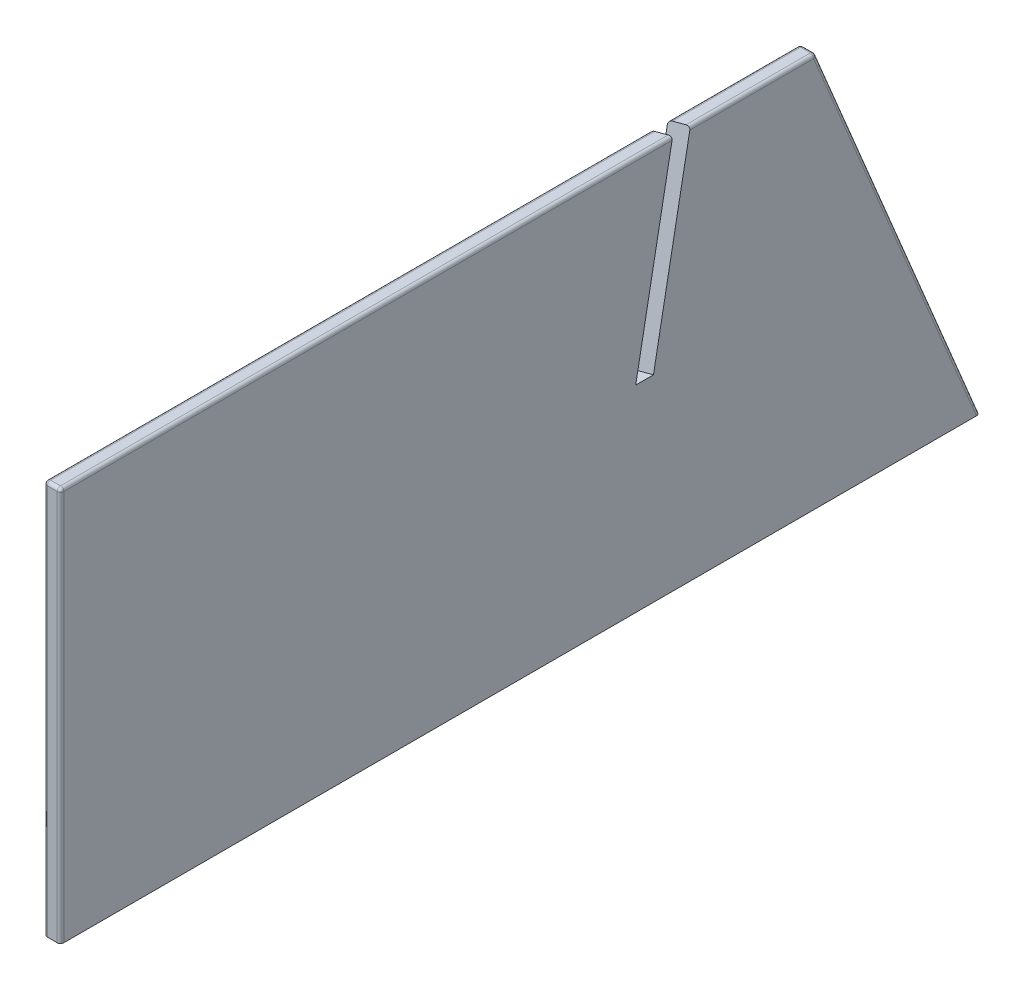
ISO-10303-21;
HEADER;
FILE_DESCRIPTION(('STEP AP214'),'2;1');
FILE_NAME('part.step','',(''),(''),'','','');
FILE_SCHEMA(('AUTOMOTIVE_DESIGN { 1 0 10303 214 1 1 1 1 }'));
ENDSEC;
DATA;
#1=APPLICATION_CONTEXT('core data for automotive mechanical design processes');
#2=APPLICATION_PROTOCOL_DEFINITION('international standard','automotive_design',2000,#1);
#3=PRODUCT_CONTEXT('',#1,'mechanical');
#4=PRODUCT('Part','Part','',(#3));
#5=PRODUCT_RELATED_PRODUCT_CATEGORY('part','',(#4));
#6=PRODUCT_DEFINITION_FORMATION('','',#4);
#7=PRODUCT_DEFINITION_CONTEXT('part definition',#1,'design');
#8=PRODUCT_DEFINITION('design','',#6,#7);
#9=PRODUCT_DEFINITION_SHAPE('','',#8);
#10=(LENGTH_UNIT() NAMED_UNIT(*) SI_UNIT(.MILLI.,.METRE.));
#11=(NAMED_UNIT(*) PLANE_ANGLE_UNIT() SI_UNIT($,.RADIAN.));
#12=(NAMED_UNIT(*) SI_UNIT($,.STERADIAN.) SOLID_ANGLE_UNIT());
#13=UNCERTAINTY_MEASURE_WITH_UNIT(LENGTH_MEASURE(1.E-05),#10,'distance_accuracy_value','');
#14=(GEOMETRIC_REPRESENTATION_CONTEXT(3) GLOBAL_UNCERTAINTY_ASSIGNED_CONTEXT((#13)) GLOBAL_UNIT_ASSIGNED_CONTEXT((#10,
#11,#12)) REPRESENTATION_CONTEXT('',''));
#15=CARTESIAN_POINT('',(0.,0.,0.));
#16=DIRECTION('',(0.,0.,1.));
#17=DIRECTION('',(1.,0.,0.));
#18=AXIS2_PLACEMENT_3D('',#15,#16,#17);
#19=CARTESIAN_POINT('',(12.7,304.8,0.));
#20=DIRECTION('',(0.,1.,0.));
#21=DIRECTION('',(0.,0.,1.));
#22=AXIS2_PLACEMENT_3D('',#19,#20,#21);
#23=PLANE('',#22);
#24=DIRECTION('',(-0.939692620785908,0.,0.342020143325669));
#25=VECTOR('',#24,1.);
#26=CARTESIAN_POINT('',(84.6850060438252,304.8,-513.422821355286));
#27=LINE('',#26,#25);
#28=CARTESIAN_POINT('',(10.16,304.8,-486.297937446825));
#29=VERTEX_POINT('',#28);
#30=CARTESIAN_POINT('',(2.54000000000001,304.8,-483.524484261717));
#31=VERTEX_POINT('',#30);
#32=EDGE_CURVE('E412',#29,#31,#27,.T.);
#33=ORIENTED_EDGE('',*,*,#32,.F.);
#34=DIRECTION('',(0.,0.,-1.));
#35=VECTOR('',#34,1.);
#36=CARTESIAN_POINT('',(10.16,304.8,0.));
#37=LINE('',#36,#35);
#38=CARTESIAN_POINT('',(10.16,304.8,-582.506666666667));
#39=VERTEX_POINT('',#38);
#40=EDGE_CURVE('E92',#29,#39,#37,.T.);
#41=ORIENTED_EDGE('',*,*,#40,.T.);
#42=DIRECTION('',(-1.,0.,0.));
#43=VECTOR('',#42,1.);
#44=CARTESIAN_POINT('',(0.,304.8,-582.506666666667));
#45=LINE('',#44,#43);
#46=CARTESIAN_POINT('',(2.54,304.8,-582.506666666667));
#47=VERTEX_POINT('',#46);
#48=EDGE_CURVE('E96',#39,#47,#45,.T.);
#49=ORIENTED_EDGE('',*,*,#48,.T.);
#50=DIRECTION('',(0.,0.,-1.));
#51=VECTOR('',#50,1.);
#52=CARTESIAN_POINT('',(2.54,304.8,-482.599999866681));
#53=LINE('',#52,#51);
#54=EDGE_CURVE('E294',#47,#31,#53,.F.);
#55=ORIENTED_EDGE('',*,*,#54,.T.);
#56=EDGE_LOOP('',(#33,#41,#49,#55));
#57=FACE_BOUND('',#56,.T.);
#58=ADVANCED_FACE('F74',(#57),#23,.T.);
#59=CARTESIAN_POINT('',(12.7,0.,0.));
#60=DIRECTION('',(0.,0.,1.));
#61=DIRECTION('',(1.,0.,0.));
#62=AXIS2_PLACEMENT_3D('',#59,#60,#61);
#63=PLANE('',#62);
#64=DIRECTION('',(-1.,0.,0.));
#65=VECTOR('',#64,1.);
#66=CARTESIAN_POINT('',(12.7,0.,0.));
#67=LINE('',#66,#65);
#68=CARTESIAN_POINT('',(10.16,0.,0.));
#69=VERTEX_POINT('',#68);
#70=CARTESIAN_POINT('',(2.54,0.,0.));
#71=VERTEX_POINT('',#70);
#72=EDGE_CURVE('E201',#69,#71,#67,.T.);
#73=ORIENTED_EDGE('',*,*,#72,.F.);
#74=DIRECTION('',(0.,1.,0.));
#75=VECTOR('',#74,1.);
#76=CARTESIAN_POINT('',(10.16,0.,0.));
#77=LINE('',#76,#75);
#78=CARTESIAN_POINT('',(10.16,302.26,0.));
#79=VERTEX_POINT('',#78);
#80=EDGE_CURVE('E230',#69,#79,#77,.T.);
#81=ORIENTED_EDGE('',*,*,#80,.T.);
#82=DIRECTION('',(-1.,0.,0.));
#83=VECTOR('',#82,1.);
#84=CARTESIAN_POINT('',(12.7,302.26,0.));
#85=LINE('',#84,#83);
#86=CARTESIAN_POINT('',(2.54,302.26,0.));
#87=VERTEX_POINT('',#86);
#88=EDGE_CURVE('E221',#79,#87,#85,.T.);
#89=ORIENTED_EDGE('',*,*,#88,.T.);
#90=DIRECTION('',(0.,1.,0.));
#91=VECTOR('',#90,1.);
#92=CARTESIAN_POINT('',(2.54,0.,0.));
#93=LINE('',#92,#91);
#94=EDGE_CURVE('E227',#87,#71,#93,.F.);
#95=ORIENTED_EDGE('',*,*,#94,.T.);
#96=EDGE_LOOP('',(#73,#81,#89,#95));
#97=FACE_BOUND('',#96,.T.);
#98=ADVANCED_FACE('F449',(#97),#63,.T.);
#99=CARTESIAN_POINT('',(12.7,0.,0.));
#100=DIRECTION('',(0.,1.,0.));
#101=DIRECTION('',(0.,0.,1.));
#102=AXIS2_PLACEMENT_3D('',#99,#100,#101);
#103=PLANE('',#102);
#104=DIRECTION('',(0.,0.,-1.));
#105=VECTOR('',#104,1.);
#106=CARTESIAN_POINT('',(12.7,0.,0.));
#107=LINE('',#106,#105);
#108=CARTESIAN_POINT('',(12.7,0.,-2.54));
#109=VERTEX_POINT('',#108);
#110=CARTESIAN_POINT('',(12.7,0.,-708.448333333333));
#111=VERTEX_POINT('',#110);
#112=EDGE_CURVE('E380',#109,#111,#107,.T.);
#113=ORIENTED_EDGE('',*,*,#112,.F.);
#114=CARTESIAN_POINT('',(10.16,0.,-2.54));
#115=DIRECTION('',(0.,1.,0.));
#116=DIRECTION('',(0.,0.,1.));
#117=AXIS2_PLACEMENT_3D('',#114,#115,#116);
#118=CIRCLE('',#117,2.54);
#119=EDGE_CURVE('E256',#109,#69,#118,.F.);
#120=ORIENTED_EDGE('',*,*,#119,.T.);
#121=ORIENTED_EDGE('',*,*,#72,.T.);
#122=CARTESIAN_POINT('',(2.54,0.,-2.54));
#123=DIRECTION('',(0.,1.,0.));
#124=DIRECTION('',(0.,0.,1.));
#125=AXIS2_PLACEMENT_3D('',#122,#123,#124);
#126=CIRCLE('',#125,2.54);
#127=CARTESIAN_POINT('',(0.,0.,-2.54));
#128=VERTEX_POINT('',#127);
#129=EDGE_CURVE('E253',#71,#128,#126,.F.);
#130=ORIENTED_EDGE('',*,*,#129,.T.);
#131=DIRECTION('',(0.,0.,-1.));
#132=VECTOR('',#131,1.);
#133=CARTESIAN_POINT('',(0.,0.,0.));
#134=LINE('',#133,#132);
#135=CARTESIAN_POINT('',(0.,0.,-708.448333333333));
#136=VERTEX_POINT('',#135);
#137=EDGE_CURVE('E371',#128,#136,#134,.T.);
#138=ORIENTED_EDGE('',*,*,#137,.T.);
#139=CARTESIAN_POINT('',(2.54,0.,-708.448333333333));
#140=DIRECTION('',(0.,1.,0.));
#141=DIRECTION('',(0.,0.,1.));
#142=AXIS2_PLACEMENT_3D('',#139,#140,#141);
#143=ELLIPSE('',#142,2.75166666666667,2.54);
#144=CARTESIAN_POINT('',(2.54,0.,-711.2));
#145=VERTEX_POINT('',#144);
#146=EDGE_CURVE('E247',#136,#145,#143,.F.);
#147=ORIENTED_EDGE('',*,*,#146,.T.);
#148=DIRECTION('',(-1.,0.,0.));
#149=VECTOR('',#148,1.);
#150=CARTESIAN_POINT('',(12.7,0.,-711.2));
#151=LINE('',#150,#149);
#152=CARTESIAN_POINT('',(10.16,0.,-711.2));
#153=VERTEX_POINT('',#152);
#154=EDGE_CURVE('E362',#153,#145,#151,.T.);
#155=ORIENTED_EDGE('',*,*,#154,.F.);
#156=CARTESIAN_POINT('',(10.16,0.,-708.448333333333));
#157=DIRECTION('',(0.,1.,0.));
#158=DIRECTION('',(0.,0.,-1.));
#159=AXIS2_PLACEMENT_3D('',#156,#157,#158);
#160=ELLIPSE('',#159,2.75166666666667,2.54);
#161=EDGE_CURVE('E250',#153,#111,#160,.F.);
#162=ORIENTED_EDGE('',*,*,#161,.T.);
#163=EDGE_LOOP('',(#113,#120,#121,#130,#138,#147,#155,#162));
#164=FACE_BOUND('',#163,.T.);
#165=ADVANCED_FACE('F376',(#164),#103,.F.);
#166=CARTESIAN_POINT('',(12.7,252.497041420118,-605.992899408284));
#167=DIRECTION('',(0.,-0.384615384615385,0.923076923076923));
#168=DIRECTION('',(0.,-0.923076923076923,-0.384615384615385));
#169=AXIS2_PLACEMENT_3D('',#166,#167,#168);
#170=PLANE('',#169);
#171=DIRECTION('',(-1.,0.,0.));
#172=VECTOR('',#171,1.);
#173=CARTESIAN_POINT('',(12.7,303.236923076923,-584.851282051282));
#174=LINE('',#173,#172);
#175=CARTESIAN_POINT('',(2.54,303.236923076923,-584.851282051282));
#176=VERTEX_POINT('',#175);
#177=CARTESIAN_POINT('',(10.16,303.236923076923,-584.851282051282));
#178=VERTEX_POINT('',#177);
#179=EDGE_CURVE('E288',#176,#178,#174,.F.);
#180=ORIENTED_EDGE('',*,*,#179,.T.);
#181=DIRECTION('',(0.,0.923076923076923,0.384615384615385));
#182=VECTOR('',#181,1.);
#183=CARTESIAN_POINT('',(10.16,0.,-711.2));
#184=LINE('',#183,#182);
#185=EDGE_CURVE('E291',#178,#153,#184,.F.);
#186=ORIENTED_EDGE('',*,*,#185,.T.);
#187=ORIENTED_EDGE('',*,*,#154,.T.);
#188=DIRECTION('',(0.,0.923076923076923,0.384615384615385));
#189=VECTOR('',#188,1.);
#190=CARTESIAN_POINT('',(2.54,252.497041420118,-605.992899408284));
#191=LINE('',#190,#189);
#192=EDGE_CURVE('E285',#145,#176,#191,.T.);
#193=ORIENTED_EDGE('',*,*,#192,.T.);
#194=EDGE_LOOP('',(#180,#186,#187,#193));
#195=FACE_BOUND('',#194,.T.);
#196=ADVANCED_FACE('F358',(#195),#170,.F.);
#197=DIRECTION('',(-0.939692620785908,0.,0.342020143325669));
#198=VECTOR('',#197,1.);
#199=CARTESIAN_POINT('',(89.0956697565652,304.8,-501.304622399725));
#200=LINE('',#199,#198);
#201=CARTESIAN_POINT('',(10.16,304.8,-472.574388186469));
#202=VERTEX_POINT('',#201);
#203=CARTESIAN_POINT('',(2.54,304.8,-469.80093500136));
#204=VERTEX_POINT('',#203);
#205=EDGE_CURVE('E211',#202,#204,#200,.T.);
#206=ORIENTED_EDGE('',*,*,#205,.T.);
#207=DIRECTION('',(0.,0.,-1.));
#208=VECTOR('',#207,1.);
#209=CARTESIAN_POINT('',(2.54,304.8,0.));
#210=LINE('',#209,#208);
#211=CARTESIAN_POINT('',(2.54,304.8,-2.54));
#212=VERTEX_POINT('',#211);
#213=EDGE_CURVE('E277',#204,#212,#210,.F.);
#214=ORIENTED_EDGE('',*,*,#213,.T.);
#215=DIRECTION('',(-1.,0.,0.));
#216=VECTOR('',#215,1.);
#217=CARTESIAN_POINT('',(12.7,304.8,-2.54));
#218=LINE('',#217,#216);
#219=CARTESIAN_POINT('',(10.16,304.8,-2.54));
#220=VERTEX_POINT('',#219);
#221=EDGE_CURVE('E274',#212,#220,#218,.F.);
#222=ORIENTED_EDGE('',*,*,#221,.T.);
#223=DIRECTION('',(0.,0.,-1.));
#224=VECTOR('',#223,1.);
#225=CARTESIAN_POINT('',(10.16,304.8,0.));
#226=LINE('',#225,#224);
#227=EDGE_CURVE('E271',#220,#202,#226,.T.);
#228=ORIENTED_EDGE('',*,*,#227,.T.);
#229=EDGE_LOOP('',(#206,#214,#222,#228));
#230=FACE_BOUND('',#229,.T.);
#231=ADVANCED_FACE('F409',(#230),#23,.T.);
#232=CARTESIAN_POINT('',(0.,0.,0.));
#233=DIRECTION('',(1.,0.,0.));
#234=DIRECTION('',(0.,0.,-1.));
#235=AXIS2_PLACEMENT_3D('',#232,#233,#234);
#236=PLANE('',#235);
#237=ORIENTED_EDGE('',*,*,#137,.F.);
#238=DIRECTION('',(0.,1.,0.));
#239=VECTOR('',#238,1.);
#240=CARTESIAN_POINT('',(0.,304.8,-2.54));
#241=LINE('',#240,#239);
#242=CARTESIAN_POINT('',(0.,302.26,-2.54));
#243=VERTEX_POINT('',#242);
#244=EDGE_CURVE('E268',#128,#243,#241,.T.);
#245=ORIENTED_EDGE('',*,*,#244,.T.);
#246=DIRECTION('',(0.,0.,-1.));
#247=VECTOR('',#246,1.);
#248=CARTESIAN_POINT('',(0.,302.26,-468.876450606324));
#249=LINE('',#248,#247);
#250=CARTESIAN_POINT('',(0.,302.26,-468.399836742287));
#251=VERTEX_POINT('',#250);
#252=EDGE_CURVE('E265',#243,#251,#249,.T.);
#253=ORIENTED_EDGE('',*,*,#252,.T.);
#254=DIRECTION('',(0.,-0.982846674800218,0.184424547807917));
#255=VECTOR('',#254,1.);
#256=CARTESIAN_POINT('',(0.,-74.6220556918562,-397.680461604739));
#257=LINE('',#256,#255);
#258=CARTESIAN_POINT('',(0.,152.4,-440.279618764125));
#259=VERTEX_POINT('',#258);
#260=EDGE_CURVE('E407',#251,#259,#257,.T.);
#261=ORIENTED_EDGE('',*,*,#260,.T.);
#262=DIRECTION('',(0.,0.,-1.));
#263=VECTOR('',#262,1.);
#264=CARTESIAN_POINT('',(0.,152.4,0.));
#265=LINE('',#264,#263);
#266=CARTESIAN_POINT('',(0.,152.4,-454.003168024481));
#267=VERTEX_POINT('',#266);
#268=EDGE_CURVE('E209',#259,#267,#265,.T.);
#269=ORIENTED_EDGE('',*,*,#268,.T.);
#270=DIRECTION('',(0.,0.982846674800218,-0.184424547807917));
#271=VECTOR('',#270,1.);
#272=CARTESIAN_POINT('',(0.,-77.1096006894336,-410.937239828379));
#273=LINE('',#272,#271);
#274=CARTESIAN_POINT('',(0.,302.26,-482.123386002644));
#275=VERTEX_POINT('',#274);
#276=EDGE_CURVE('E386',#267,#275,#273,.T.);
#277=ORIENTED_EDGE('',*,*,#276,.T.);
#278=DIRECTION('',(0.,0.,-1.));
#279=VECTOR('',#278,1.);
#280=CARTESIAN_POINT('',(0.,302.26,-584.2));
#281=LINE('',#280,#279);
#282=CARTESIAN_POINT('',(0.,302.26,-582.506666666667));
#283=VERTEX_POINT('',#282);
#284=EDGE_CURVE('E259',#275,#283,#281,.T.);
#285=ORIENTED_EDGE('',*,*,#284,.T.);
#286=DIRECTION('',(0.,0.923076923076923,0.384615384615385));
#287=VECTOR('',#286,1.);
#288=CARTESIAN_POINT('',(0.,251.520118343195,-603.648284023669));
#289=LINE('',#288,#287);
#290=EDGE_CURVE('E262',#283,#136,#289,.F.);
#291=ORIENTED_EDGE('',*,*,#290,.T.);
#292=EDGE_LOOP('',(#237,#245,#253,#261,#269,#277,#285,#291));
#293=FACE_BOUND('',#292,.T.);
#294=ADVANCED_FACE('F370',(#293),#236,.F.);
#295=CARTESIAN_POINT('',(12.7,0.,0.));
#296=DIRECTION('',(1.,0.,0.));
#297=DIRECTION('',(0.,0.,-1.));
#298=AXIS2_PLACEMENT_3D('',#295,#296,#297);
#299=PLANE('',#298);
#300=DIRECTION('',(0.,0.,-1.));
#301=VECTOR('',#300,1.);
#302=CARTESIAN_POINT('',(12.7,302.26,0.));
#303=LINE('',#302,#301);
#304=CARTESIAN_POINT('',(12.7,302.26,-473.022258717468));
#305=VERTEX_POINT('',#304);
#306=CARTESIAN_POINT('',(12.7,302.26,-2.54));
#307=VERTEX_POINT('',#306);
#308=EDGE_CURVE('E241',#305,#307,#303,.F.);
#309=ORIENTED_EDGE('',*,*,#308,.T.);
#310=DIRECTION('',(0.,1.,0.));
#311=VECTOR('',#310,1.);
#312=CARTESIAN_POINT('',(12.7,0.,-2.54));
#313=LINE('',#312,#311);
#314=EDGE_CURVE('E244',#307,#109,#313,.F.);
#315=ORIENTED_EDGE('',*,*,#314,.T.);
#316=ORIENTED_EDGE('',*,*,#112,.T.);
#317=DIRECTION('',(0.,0.923076923076923,0.384615384615385));
#318=VECTOR('',#317,1.);
#319=CARTESIAN_POINT('',(12.7,303.823076923077,-581.855384615384));
#320=LINE('',#319,#318);
#321=CARTESIAN_POINT('',(12.7,302.26,-582.506666666667));
#322=VERTEX_POINT('',#321);
#323=EDGE_CURVE('E237',#111,#322,#320,.T.);
#324=ORIENTED_EDGE('',*,*,#323,.T.);
#325=DIRECTION('',(0.,0.,-1.));
#326=VECTOR('',#325,1.);
#327=CARTESIAN_POINT('',(12.7,302.26,0.));
#328=LINE('',#327,#326);
#329=CARTESIAN_POINT('',(12.7,302.26,-486.745807977825));
#330=VERTEX_POINT('',#329);
#331=EDGE_CURVE('E234',#322,#330,#328,.F.);
#332=ORIENTED_EDGE('',*,*,#331,.T.);
#333=DIRECTION('',(0.,0.982846674800218,-0.184424547807917));
#334=VECTOR('',#333,1.);
#335=CARTESIAN_POINT('',(12.7,-77.9474657666748,-415.402442074424));
#336=LINE('',#335,#334);
#337=CARTESIAN_POINT('',(12.7,152.4,-458.625589999662));
#338=VERTEX_POINT('',#337);
#339=EDGE_CURVE('E217',#338,#330,#336,.T.);
#340=ORIENTED_EDGE('',*,*,#339,.F.);
#341=DIRECTION('',(0.,0.,-1.));
#342=VECTOR('',#341,1.);
#343=CARTESIAN_POINT('',(12.7,152.4,0.));
#344=LINE('',#343,#342);
#345=CARTESIAN_POINT('',(12.7,152.4,-444.902040739306));
#346=VERTEX_POINT('',#345);
#347=EDGE_CURVE('E200',#346,#338,#344,.T.);
#348=ORIENTED_EDGE('',*,*,#347,.F.);
#349=DIRECTION('',(0.,-0.982846674800218,0.184424547807917));
#350=VECTOR('',#349,1.);
#351=CARTESIAN_POINT('',(12.7,-75.4599207690974,-402.145663850784));
#352=LINE('',#351,#350);
#353=EDGE_CURVE('E188',#305,#346,#352,.T.);
#354=ORIENTED_EDGE('',*,*,#353,.F.);
#355=EDGE_LOOP('',(#309,#315,#316,#324,#332,#340,#348,#354));
#356=FACE_BOUND('',#355,.T.);
#357=ADVANCED_FACE('F215',(#356),#299,.T.);
#358=CARTESIAN_POINT('',(93.8758506360528,152.4,-488.171183372424));
#359=DIRECTION('',(0.,-1.,0.));
#360=DIRECTION('',(0.,0.,-1.));
#361=AXIS2_PLACEMENT_3D('',#358,#359,#360);
#362=PLANE('',#361);
#363=DIRECTION('',(-0.939692620785908,0.,0.342020143325669));
#364=VECTOR('',#363,1.);
#365=CARTESIAN_POINT('',(98.2865143487928,152.4,-476.052984416863));
#366=LINE('',#365,#364);
#367=EDGE_CURVE('E192',#346,#259,#366,.T.);
#368=ORIENTED_EDGE('',*,*,#367,.F.);
#369=ORIENTED_EDGE('',*,*,#347,.T.);
#370=DIRECTION('',(-0.939692620785908,0.,0.342020143325669));
#371=VECTOR('',#370,1.);
#372=CARTESIAN_POINT('',(93.8758506360528,152.4,-488.171183372424));
#373=LINE('',#372,#371);
#374=EDGE_CURVE('E416',#338,#267,#373,.T.);
#375=ORIENTED_EDGE('',*,*,#374,.T.);
#376=ORIENTED_EDGE('',*,*,#268,.F.);
#377=EDGE_LOOP('',(#368,#369,#375,#376));
#378=FACE_BOUND('',#377,.T.);
#379=ADVANCED_FACE('F205',(#378),#362,.F.);
#380=CARTESIAN_POINT('',(84.6850060438252,304.8,-513.422821355286));
#381=DIRECTION('',(-0.336824088833466,-0.173648177666931,-0.925416578398323));
#382=DIRECTION('',(-0.939692620785908,0.,0.342020143325669));
#383=AXIS2_PLACEMENT_3D('',#380,#381,#382);
#384=PLANE('',#383);
#385=ORIENTED_EDGE('',*,*,#339,.T.);
#386=CARTESIAN_POINT('',(10.16,302.26,-485.821323582789));
#387=DIRECTION('',(-0.336824088833466,-0.173648177666931,-0.925416578398323));
#388=DIRECTION('',(0.822539786250798,0.424056769323343,-0.378951390583991));
#389=AXIS2_PLACEMENT_3D('',#386,#387,#388);
#390=ELLIPSE('',#389,2.74470985207131,2.54);
#391=EDGE_CURVE('E12',#330,#29,#390,.F.);
#392=ORIENTED_EDGE('',*,*,#391,.T.);
#393=ORIENTED_EDGE('',*,*,#32,.T.);
#394=CARTESIAN_POINT('',(2.54,302.26,-483.04787039768));
#395=DIRECTION('',(-0.336824088833466,-0.173648177666931,-0.925416578398323));
#396=DIRECTION('',(-0.822539786250798,-0.424056769323343,0.378951390583991));
#397=AXIS2_PLACEMENT_3D('',#394,#395,#396);
#398=ELLIPSE('',#397,2.74470985207131,2.54);
#399=EDGE_CURVE('E84',#31,#275,#398,.F.);
#400=ORIENTED_EDGE('',*,*,#399,.T.);
#401=ORIENTED_EDGE('',*,*,#276,.F.);
#402=ORIENTED_EDGE('',*,*,#374,.F.);
#403=EDGE_LOOP('',(#385,#392,#393,#400,#401,#402));
#404=FACE_BOUND('',#403,.T.);
#405=ADVANCED_FACE('F425',(#404),#384,.F.);
#406=CARTESIAN_POINT('',(98.2865143487928,152.4,-476.052984416863));
#407=DIRECTION('',(0.336824088833466,0.173648177666931,0.925416578398323));
#408=DIRECTION('',(0.939692620785908,0.,-0.342020143325669));
#409=AXIS2_PLACEMENT_3D('',#406,#407,#408);
#410=PLANE('',#409);
#411=ORIENTED_EDGE('',*,*,#260,.F.);
#412=CARTESIAN_POINT('',(2.54,302.26,-469.324321137323));
#413=DIRECTION('',(0.336824088833466,0.173648177666931,0.925416578398323));
#414=DIRECTION('',(-0.822539786250799,-0.424056769323342,0.378951390583991));
#415=AXIS2_PLACEMENT_3D('',#412,#413,#414);
#416=ELLIPSE('',#415,2.74470985207131,2.54);
#417=EDGE_CURVE('E282',#251,#204,#416,.F.);
#418=ORIENTED_EDGE('',*,*,#417,.T.);
#419=ORIENTED_EDGE('',*,*,#205,.F.);
#420=CARTESIAN_POINT('',(10.16,302.26,-472.097774322432));
#421=DIRECTION('',(0.336824088833466,0.173648177666931,0.925416578398323));
#422=DIRECTION('',(0.822539786250799,0.424056769323342,-0.378951390583991));
#423=AXIS2_PLACEMENT_3D('',#420,#421,#422);
#424=ELLIPSE('',#423,2.74470985207131,2.54);
#425=EDGE_CURVE('E195',#202,#305,#424,.F.);
#426=ORIENTED_EDGE('',*,*,#425,.T.);
#427=ORIENTED_EDGE('',*,*,#353,.T.);
#428=ORIENTED_EDGE('',*,*,#367,.T.);
#429=EDGE_LOOP('',(#411,#418,#419,#426,#427,#428));
#430=FACE_BOUND('',#429,.T.);
#431=ADVANCED_FACE('F191',(#430),#410,.F.);
#432=CARTESIAN_POINT('',(2.54,0.,-2.54));
#433=DIRECTION('',(0.,-1.,0.));
#434=DIRECTION('',(0.,0.,-1.));
#435=AXIS2_PLACEMENT_3D('',#432,#433,#434);
#436=CYLINDRICAL_SURFACE('',#435,2.54);
#437=ORIENTED_EDGE('',*,*,#129,.F.);
#438=ORIENTED_EDGE('',*,*,#94,.F.);
#439=CARTESIAN_POINT('',(2.54,302.26,-2.54));
#440=DIRECTION('',(0.,1.,0.));
#441=DIRECTION('',(0.,0.,1.));
#442=AXIS2_PLACEMENT_3D('',#439,#440,#441);
#443=CIRCLE('',#442,2.54);
#444=EDGE_CURVE('E212',#243,#87,#443,.T.);
#445=ORIENTED_EDGE('',*,*,#444,.F.);
#446=ORIENTED_EDGE('',*,*,#244,.F.);
#447=EDGE_LOOP('',(#437,#438,#445,#446));
#448=FACE_BOUND('',#447,.T.);
#449=ADVANCED_FACE('F397',(#448),#436,.T.);
#450=CARTESIAN_POINT('',(2.54,302.26,0.));
#451=DIRECTION('',(0.,0.,1.));
#452=DIRECTION('',(1.,0.,0.));
#453=AXIS2_PLACEMENT_3D('',#450,#451,#452);
#454=CYLINDRICAL_SURFACE('',#453,2.54);
#455=ORIENTED_EDGE('',*,*,#417,.F.);
#456=ORIENTED_EDGE('',*,*,#252,.F.);
#457=CARTESIAN_POINT('',(2.54,302.26,-2.54));
#458=DIRECTION('',(0.,0.,1.));
#459=DIRECTION('',(1.,0.,0.));
#460=AXIS2_PLACEMENT_3D('',#457,#458,#459);
#461=CIRCLE('',#460,2.54);
#462=EDGE_CURVE('E318',#212,#243,#461,.T.);
#463=ORIENTED_EDGE('',*,*,#462,.F.);
#464=ORIENTED_EDGE('',*,*,#213,.F.);
#465=EDGE_LOOP('',(#455,#456,#463,#464));
#466=FACE_BOUND('',#465,.T.);
#467=ADVANCED_FACE('F403',(#466),#454,.T.);
#468=CARTESIAN_POINT('',(2.54,302.26,-2.54));
#469=DIRECTION('',(-1.,0.,0.));
#470=DIRECTION('',(0.,0.,1.));
#471=AXIS2_PLACEMENT_3D('',#468,#469,#470);
#472=SPHERICAL_SURFACE('',#471,2.54);
#473=ORIENTED_EDGE('',*,*,#462,.T.);
#474=ORIENTED_EDGE('',*,*,#444,.T.);
#475=CARTESIAN_POINT('',(2.54,302.26,-2.54));
#476=DIRECTION('',(-1.,0.,0.));
#477=DIRECTION('',(0.,0.,1.));
#478=AXIS2_PLACEMENT_3D('',#475,#476,#477);
#479=CIRCLE('',#478,2.54);
#480=EDGE_CURVE('E314',#212,#87,#479,.F.);
#481=ORIENTED_EDGE('',*,*,#480,.F.);
#482=EDGE_LOOP('',(#473,#474,#481));
#483=FACE_BOUND('',#482,.T.);
#484=ADVANCED_FACE('F470',(#483),#472,.T.);
#485=CARTESIAN_POINT('',(12.7,302.26,-2.54));
#486=DIRECTION('',(-1.,0.,0.));
#487=DIRECTION('',(0.,0.,1.));
#488=AXIS2_PLACEMENT_3D('',#485,#486,#487);
#489=CYLINDRICAL_SURFACE('',#488,2.54);
#490=ORIENTED_EDGE('',*,*,#480,.T.);
#491=ORIENTED_EDGE('',*,*,#88,.F.);
#492=CARTESIAN_POINT('',(10.16,302.26,-2.54));
#493=DIRECTION('',(1.,0.,0.));
#494=DIRECTION('',(0.,0.,-1.));
#495=AXIS2_PLACEMENT_3D('',#492,#493,#494);
#496=CIRCLE('',#495,2.54);
#497=EDGE_CURVE('E310',#220,#79,#496,.T.);
#498=ORIENTED_EDGE('',*,*,#497,.F.);
#499=ORIENTED_EDGE('',*,*,#221,.F.);
#500=EDGE_LOOP('',(#490,#491,#498,#499));
#501=FACE_BOUND('',#500,.T.);
#502=ADVANCED_FACE('F448',(#501),#489,.T.);
#503=CARTESIAN_POINT('',(10.16,302.26,0.));
#504=DIRECTION('',(0.,0.,-1.));
#505=DIRECTION('',(-1.,0.,0.));
#506=AXIS2_PLACEMENT_3D('',#503,#504,#505);
#507=CYLINDRICAL_SURFACE('',#506,2.54);
#508=ORIENTED_EDGE('',*,*,#425,.F.);
#509=ORIENTED_EDGE('',*,*,#227,.F.);
#510=CARTESIAN_POINT('',(10.16,302.26,-2.54));
#511=DIRECTION('',(0.,0.,1.));
#512=DIRECTION('',(1.,0.,0.));
#513=AXIS2_PLACEMENT_3D('',#510,#511,#512);
#514=CIRCLE('',#513,2.54);
#515=EDGE_CURVE('E306',#307,#220,#514,.T.);
#516=ORIENTED_EDGE('',*,*,#515,.F.);
#517=ORIENTED_EDGE('',*,*,#308,.F.);
#518=EDGE_LOOP('',(#508,#509,#516,#517));
#519=FACE_BOUND('',#518,.T.);
#520=ADVANCED_FACE('F464',(#519),#507,.T.);
#521=CARTESIAN_POINT('',(10.16,302.26,-2.54));
#522=DIRECTION('',(0.,1.,0.));
#523=DIRECTION('',(0.,0.,1.));
#524=AXIS2_PLACEMENT_3D('',#521,#522,#523);
#525=SPHERICAL_SURFACE('',#524,2.54);
#526=ORIENTED_EDGE('',*,*,#515,.T.);
#527=ORIENTED_EDGE('',*,*,#497,.T.);
#528=CARTESIAN_POINT('',(10.16,302.26,-2.54));
#529=DIRECTION('',(0.,1.,0.));
#530=DIRECTION('',(0.,0.,1.));
#531=AXIS2_PLACEMENT_3D('',#528,#529,#530);
#532=CIRCLE('',#531,2.54);
#533=EDGE_CURVE('E303',#307,#79,#532,.F.);
#534=ORIENTED_EDGE('',*,*,#533,.F.);
#535=EDGE_LOOP('',(#526,#527,#534));
#536=FACE_BOUND('',#535,.T.);
#537=ADVANCED_FACE('F443',(#536),#525,.T.);
#538=CARTESIAN_POINT('',(10.16,0.,-2.54));
#539=DIRECTION('',(0.,1.,0.));
#540=DIRECTION('',(0.,0.,1.));
#541=AXIS2_PLACEMENT_3D('',#538,#539,#540);
#542=CYLINDRICAL_SURFACE('',#541,2.54);
#543=ORIENTED_EDGE('',*,*,#119,.F.);
#544=ORIENTED_EDGE('',*,*,#314,.F.);
#545=ORIENTED_EDGE('',*,*,#533,.T.);
#546=ORIENTED_EDGE('',*,*,#80,.F.);
#547=EDGE_LOOP('',(#543,#544,#545,#546));
#548=FACE_BOUND('',#547,.T.);
#549=ADVANCED_FACE('F441',(#548),#542,.T.);
#550=CARTESIAN_POINT('',(2.54,302.26,0.));
#551=DIRECTION('',(0.,0.,1.));
#552=DIRECTION('',(1.,0.,0.));
#553=AXIS2_PLACEMENT_3D('',#550,#551,#552);
#554=CYLINDRICAL_SURFACE('',#553,2.54);
#555=ORIENTED_EDGE('',*,*,#399,.F.);
#556=ORIENTED_EDGE('',*,*,#54,.F.);
#557=CARTESIAN_POINT('',(2.54,302.26,-582.506666666667));
#558=DIRECTION('',(0.,0.,-1.));
#559=DIRECTION('',(0.,1.,0.));
#560=AXIS2_PLACEMENT_3D('',#557,#558,#559);
#561=CIRCLE('',#560,2.54);
#562=EDGE_CURVE('E78',#283,#47,#561,.T.);
#563=ORIENTED_EDGE('',*,*,#562,.F.);
#564=ORIENTED_EDGE('',*,*,#284,.F.);
#565=EDGE_LOOP('',(#555,#556,#563,#564));
#566=FACE_BOUND('',#565,.T.);
#567=ADVANCED_FACE('F76',(#566),#554,.T.);
#568=CARTESIAN_POINT('',(2.54,251.520118343195,-603.648284023669));
#569=DIRECTION('',(0.,0.923076923076923,0.384615384615385));
#570=DIRECTION('',(0.,-0.384615384615385,0.923076923076923));
#571=AXIS2_PLACEMENT_3D('',#568,#569,#570);
#572=CYLINDRICAL_SURFACE('',#571,2.54);
#573=ORIENTED_EDGE('',*,*,#146,.F.);
#574=ORIENTED_EDGE('',*,*,#290,.F.);
#575=CARTESIAN_POINT('',(2.54,302.26,-582.506666666667));
#576=DIRECTION('',(0.,0.92307692307692,0.384615384615391));
#577=DIRECTION('',(0.,-0.384615384615391,0.923076923076921));
#578=AXIS2_PLACEMENT_3D('',#575,#576,#577);
#579=CIRCLE('',#578,2.54);
#580=EDGE_CURVE('E339',#176,#283,#579,.T.);
#581=ORIENTED_EDGE('',*,*,#580,.F.);
#582=ORIENTED_EDGE('',*,*,#192,.F.);
#583=EDGE_LOOP('',(#573,#574,#581,#582));
#584=FACE_BOUND('',#583,.T.);
#585=ADVANCED_FACE('F366',(#584),#572,.T.);
#586=CARTESIAN_POINT('',(2.54,302.26,-582.506666666667));
#587=DIRECTION('',(-1.,0.,0.));
#588=DIRECTION('',(0.,0.,1.));
#589=AXIS2_PLACEMENT_3D('',#586,#587,#588);
#590=SPHERICAL_SURFACE('',#589,2.54);
#591=ORIENTED_EDGE('',*,*,#580,.T.);
#592=ORIENTED_EDGE('',*,*,#562,.T.);
#593=CARTESIAN_POINT('',(2.54,302.26,-582.506666666667));
#594=DIRECTION('',(-1.,0.,0.));
#595=DIRECTION('',(0.,0.,1.));
#596=AXIS2_PLACEMENT_3D('',#593,#594,#595);
#597=CIRCLE('',#596,2.54);
#598=EDGE_CURVE('E336',#176,#47,#597,.F.);
#599=ORIENTED_EDGE('',*,*,#598,.F.);
#600=EDGE_LOOP('',(#591,#592,#599));
#601=FACE_BOUND('',#600,.T.);
#602=ADVANCED_FACE('F348',(#601),#590,.T.);
#603=CARTESIAN_POINT('',(10.16,302.26,0.));
#604=DIRECTION('',(0.,0.,-1.));
#605=DIRECTION('',(-1.,0.,0.));
#606=AXIS2_PLACEMENT_3D('',#603,#604,#605);
#607=CYLINDRICAL_SURFACE('',#606,2.54);
#608=ORIENTED_EDGE('',*,*,#391,.F.);
#609=ORIENTED_EDGE('',*,*,#331,.F.);
#610=CARTESIAN_POINT('',(10.16,302.26,-582.506666666667));
#611=DIRECTION('',(0.,0.,-1.));
#612=DIRECTION('',(-1.,0.,0.));
#613=AXIS2_PLACEMENT_3D('',#610,#611,#612);
#614=CIRCLE('',#613,2.54);
#615=EDGE_CURVE('E332',#39,#322,#614,.T.);
#616=ORIENTED_EDGE('',*,*,#615,.F.);
#617=ORIENTED_EDGE('',*,*,#40,.F.);
#618=EDGE_LOOP('',(#608,#609,#616,#617));
#619=FACE_BOUND('',#618,.T.);
#620=ADVANCED_FACE('F428',(#619),#607,.T.);
#621=CARTESIAN_POINT('',(12.7,302.26,-582.506666666667));
#622=DIRECTION('',(1.,0.,0.));
#623=DIRECTION('',(0.,0.,-1.));
#624=AXIS2_PLACEMENT_3D('',#621,#622,#623);
#625=CYLINDRICAL_SURFACE('',#624,2.54);
#626=ORIENTED_EDGE('',*,*,#598,.T.);
#627=ORIENTED_EDGE('',*,*,#48,.F.);
#628=CARTESIAN_POINT('',(10.16,302.26,-582.506666666667));
#629=DIRECTION('',(1.,0.,0.));
#630=DIRECTION('',(0.,0.,-1.));
#631=AXIS2_PLACEMENT_3D('',#628,#629,#630);
#632=CIRCLE('',#631,2.54);
#633=EDGE_CURVE('E328',#178,#39,#632,.T.);
#634=ORIENTED_EDGE('',*,*,#633,.F.);
#635=ORIENTED_EDGE('',*,*,#179,.F.);
#636=EDGE_LOOP('',(#626,#627,#634,#635));
#637=FACE_BOUND('',#636,.T.);
#638=ADVANCED_FACE('F353',(#637),#625,.T.);
#639=CARTESIAN_POINT('',(10.16,302.26,-582.506666666667));
#640=DIRECTION('',(1.,0.,0.));
#641=DIRECTION('',(0.,0.,-1.));
#642=AXIS2_PLACEMENT_3D('',#639,#640,#641);
#643=SPHERICAL_SURFACE('',#642,2.54);
#644=ORIENTED_EDGE('',*,*,#633,.T.);
#645=ORIENTED_EDGE('',*,*,#615,.T.);
#646=CARTESIAN_POINT('',(10.16,302.26,-582.506666666667));
#647=DIRECTION('',(0.,0.923076923076935,0.384615384615357));
#648=DIRECTION('',(0.,-0.384615384615357,0.923076923076935));
#649=AXIS2_PLACEMENT_3D('',#646,#647,#648);
#650=CIRCLE('',#649,2.54);
#651=EDGE_CURVE('E325',#178,#322,#650,.F.);
#652=ORIENTED_EDGE('',*,*,#651,.F.);
#653=EDGE_LOOP('',(#644,#645,#652));
#654=FACE_BOUND('',#653,.T.);
#655=ADVANCED_FACE('F432',(#654),#643,.T.);
#656=CARTESIAN_POINT('',(10.16,251.520118343195,-603.648284023669));
#657=DIRECTION('',(0.,-0.923076923076923,-0.384615384615385));
#658=DIRECTION('',(0.,0.384615384615385,-0.923076923076923));
#659=AXIS2_PLACEMENT_3D('',#656,#657,#658);
#660=CYLINDRICAL_SURFACE('',#659,2.54);
#661=ORIENTED_EDGE('',*,*,#161,.F.);
#662=ORIENTED_EDGE('',*,*,#185,.F.);
#663=ORIENTED_EDGE('',*,*,#651,.T.);
#664=ORIENTED_EDGE('',*,*,#323,.F.);
#665=EDGE_LOOP('',(#661,#662,#663,#664));
#666=FACE_BOUND('',#665,.T.);
#667=ADVANCED_FACE('F436',(#666),#660,.T.);
#668=CLOSED_SHELL('',(#58,#98,#165,#196,#231,#294,#357,#379,#405,#431,#449,#467,#484,#502,#520,
#537,#549,#567,#585,#602,#620,#638,#655,#667));
#669=MANIFOLD_SOLID_BREP('B2',#668);
#670=ADVANCED_BREP_SHAPE_REPRESENTATION('',(#18,#669),#14);
#671=SHAPE_DEFINITION_REPRESENTATION(#9,#670);
ENDSEC;
END-ISO-10303-21;
